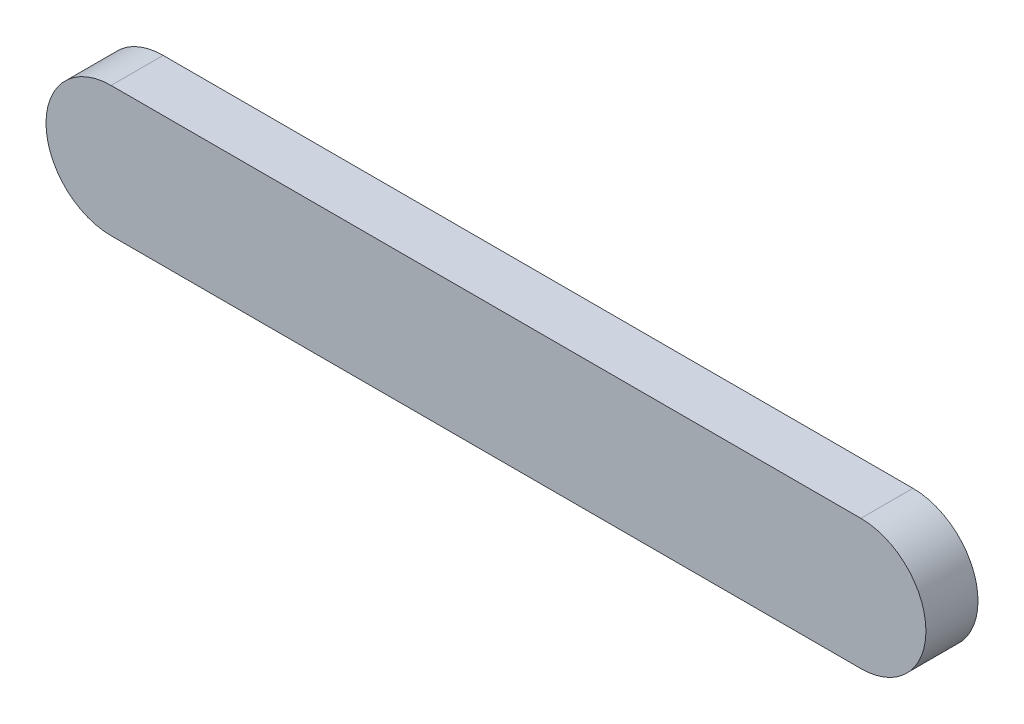
ISO-10303-21;
HEADER;
FILE_DESCRIPTION(('STEP AP214'),'2;1');
FILE_NAME('part.step','',(''),(''),'','','');
FILE_SCHEMA(('AUTOMOTIVE_DESIGN { 1 0 10303 214 1 1 1 1 }'));
ENDSEC;
DATA;
#1=APPLICATION_CONTEXT('core data for automotive mechanical design processes');
#2=APPLICATION_PROTOCOL_DEFINITION('international standard','automotive_design',2000,#1);
#3=PRODUCT_CONTEXT('',#1,'mechanical');
#4=PRODUCT('Part','Part','',(#3));
#5=PRODUCT_RELATED_PRODUCT_CATEGORY('part','',(#4));
#6=PRODUCT_DEFINITION_FORMATION('','',#4);
#7=PRODUCT_DEFINITION_CONTEXT('part definition',#1,'design');
#8=PRODUCT_DEFINITION('design','',#6,#7);
#9=PRODUCT_DEFINITION_SHAPE('','',#8);
#10=(LENGTH_UNIT() NAMED_UNIT(*) SI_UNIT(.MILLI.,.METRE.));
#11=(NAMED_UNIT(*) PLANE_ANGLE_UNIT() SI_UNIT($,.RADIAN.));
#12=(NAMED_UNIT(*) SI_UNIT($,.STERADIAN.) SOLID_ANGLE_UNIT());
#13=UNCERTAINTY_MEASURE_WITH_UNIT(LENGTH_MEASURE(1.E-05),#10,'distance_accuracy_value','');
#14=(GEOMETRIC_REPRESENTATION_CONTEXT(3) GLOBAL_UNCERTAINTY_ASSIGNED_CONTEXT((#13)) GLOBAL_UNIT_ASSIGNED_CONTEXT((#10,
#11,#12)) REPRESENTATION_CONTEXT('',''));
#15=CARTESIAN_POINT('',(0.,0.,0.));
#16=DIRECTION('',(0.,0.,1.));
#17=DIRECTION('',(1.,0.,0.));
#18=AXIS2_PLACEMENT_3D('',#15,#16,#17);
#19=CARTESIAN_POINT('',(0.,0.,20.));
#20=DIRECTION('',(0.,0.,-1.));
#21=DIRECTION('',(-1.,0.,0.));
#22=AXIS2_PLACEMENT_3D('',#19,#20,#21);
#23=CYLINDRICAL_SURFACE('',#22,25.);
#24=CARTESIAN_POINT('',(0.,0.,0.));
#25=DIRECTION('',(0.,0.,1.));
#26=DIRECTION('',(1.,0.,0.));
#27=AXIS2_PLACEMENT_3D('',#24,#25,#26);
#28=CIRCLE('',#27,25.);
#29=CARTESIAN_POINT('',(0.,25.,0.));
#30=VERTEX_POINT('',#29);
#31=CARTESIAN_POINT('',(0.,-25.,0.));
#32=VERTEX_POINT('',#31);
#33=EDGE_CURVE('E102',#30,#32,#28,.T.);
#34=ORIENTED_EDGE('',*,*,#33,.T.);
#35=DIRECTION('',(0.,0.,-1.));
#36=VECTOR('',#35,1.);
#37=CARTESIAN_POINT('',(0.,-25.,20.));
#38=LINE('',#37,#36);
#39=CARTESIAN_POINT('',(0.,-25.,20.));
#40=VERTEX_POINT('',#39);
#41=EDGE_CURVE('E11',#40,#32,#38,.T.);
#42=ORIENTED_EDGE('',*,*,#41,.F.);
#43=CARTESIAN_POINT('',(0.,0.,20.));
#44=DIRECTION('',(0.,0.,1.));
#45=DIRECTION('',(1.,0.,0.));
#46=AXIS2_PLACEMENT_3D('',#43,#44,#45);
#47=CIRCLE('',#46,25.);
#48=CARTESIAN_POINT('',(0.,25.,20.));
#49=VERTEX_POINT('',#48);
#50=EDGE_CURVE('E90',#49,#40,#47,.T.);
#51=ORIENTED_EDGE('',*,*,#50,.F.);
#52=DIRECTION('',(0.,0.,-1.));
#53=VECTOR('',#52,1.);
#54=CARTESIAN_POINT('',(0.,25.,20.));
#55=LINE('',#54,#53);
#56=EDGE_CURVE('E98',#49,#30,#55,.T.);
#57=ORIENTED_EDGE('',*,*,#56,.T.);
#58=EDGE_LOOP('',(#34,#42,#51,#57));
#59=FACE_BOUND('',#58,.T.);
#60=ADVANCED_FACE('F39',(#59),#23,.T.);
#61=CARTESIAN_POINT('',(0.,-25.,20.));
#62=DIRECTION('',(0.,1.,0.));
#63=DIRECTION('',(0.,0.,1.));
#64=AXIS2_PLACEMENT_3D('',#61,#62,#63);
#65=PLANE('',#64);
#66=DIRECTION('',(1.,0.,0.));
#67=VECTOR('',#66,1.);
#68=CARTESIAN_POINT('',(0.,-25.,0.));
#69=LINE('',#68,#67);
#70=CARTESIAN_POINT('',(288.,-25.,0.));
#71=VERTEX_POINT('',#70);
#72=EDGE_CURVE('E94',#32,#71,#69,.T.);
#73=ORIENTED_EDGE('',*,*,#72,.T.);
#74=DIRECTION('',(0.,0.,-1.));
#75=VECTOR('',#74,1.);
#76=CARTESIAN_POINT('',(288.,-25.,20.));
#77=LINE('',#76,#75);
#78=CARTESIAN_POINT('',(288.,-25.,20.));
#79=VERTEX_POINT('',#78);
#80=EDGE_CURVE('E47',#79,#71,#77,.T.);
#81=ORIENTED_EDGE('',*,*,#80,.F.);
#82=DIRECTION('',(1.,0.,0.));
#83=VECTOR('',#82,1.);
#84=CARTESIAN_POINT('',(0.,-25.,20.));
#85=LINE('',#84,#83);
#86=EDGE_CURVE('E85',#40,#79,#85,.T.);
#87=ORIENTED_EDGE('',*,*,#86,.F.);
#88=ORIENTED_EDGE('',*,*,#41,.T.);
#89=EDGE_LOOP('',(#73,#81,#87,#88));
#90=FACE_BOUND('',#89,.T.);
#91=ADVANCED_FACE('F93',(#90),#65,.F.);
#92=CARTESIAN_POINT('',(288.,0.,20.));
#93=DIRECTION('',(0.,0.,-1.));
#94=DIRECTION('',(-1.,0.,0.));
#95=AXIS2_PLACEMENT_3D('',#92,#93,#94);
#96=CYLINDRICAL_SURFACE('',#95,25.);
#97=CARTESIAN_POINT('',(288.,0.,0.));
#98=DIRECTION('',(0.,0.,1.));
#99=DIRECTION('',(1.,0.,0.));
#100=AXIS2_PLACEMENT_3D('',#97,#98,#99);
#101=CIRCLE('',#100,25.);
#102=CARTESIAN_POINT('',(288.,25.,0.));
#103=VERTEX_POINT('',#102);
#104=EDGE_CURVE('E72',#71,#103,#101,.T.);
#105=ORIENTED_EDGE('',*,*,#104,.T.);
#106=DIRECTION('',(0.,0.,-1.));
#107=VECTOR('',#106,1.);
#108=CARTESIAN_POINT('',(288.,25.,20.));
#109=LINE('',#108,#107);
#110=CARTESIAN_POINT('',(288.,25.,20.));
#111=VERTEX_POINT('',#110);
#112=EDGE_CURVE('E95',#111,#103,#109,.T.);
#113=ORIENTED_EDGE('',*,*,#112,.F.);
#114=CARTESIAN_POINT('',(288.,0.,20.));
#115=DIRECTION('',(0.,0.,1.));
#116=DIRECTION('',(1.,0.,0.));
#117=AXIS2_PLACEMENT_3D('',#114,#115,#116);
#118=CIRCLE('',#117,25.);
#119=EDGE_CURVE('E88',#79,#111,#118,.T.);
#120=ORIENTED_EDGE('',*,*,#119,.F.);
#121=ORIENTED_EDGE('',*,*,#80,.T.);
#122=EDGE_LOOP('',(#105,#113,#120,#121));
#123=FACE_BOUND('',#122,.T.);
#124=ADVANCED_FACE('F96',(#123),#96,.T.);
#125=CARTESIAN_POINT('',(0.,25.,20.));
#126=DIRECTION('',(0.,-1.,0.));
#127=DIRECTION('',(0.,0.,-1.));
#128=AXIS2_PLACEMENT_3D('',#125,#126,#127);
#129=PLANE('',#128);
#130=DIRECTION('',(-1.,0.,0.));
#131=VECTOR('',#130,1.);
#132=CARTESIAN_POINT('',(0.,25.,0.));
#133=LINE('',#132,#131);
#134=EDGE_CURVE('E78',#103,#30,#133,.T.);
#135=ORIENTED_EDGE('',*,*,#134,.T.);
#136=ORIENTED_EDGE('',*,*,#56,.F.);
#137=DIRECTION('',(-1.,0.,0.));
#138=VECTOR('',#137,1.);
#139=CARTESIAN_POINT('',(0.,25.,20.));
#140=LINE('',#139,#138);
#141=EDGE_CURVE('E55',#111,#49,#140,.T.);
#142=ORIENTED_EDGE('',*,*,#141,.F.);
#143=ORIENTED_EDGE('',*,*,#112,.T.);
#144=EDGE_LOOP('',(#135,#136,#142,#143));
#145=FACE_BOUND('',#144,.T.);
#146=ADVANCED_FACE('F109',(#145),#129,.F.);
#147=CARTESIAN_POINT('',(0.,0.,20.));
#148=DIRECTION('',(0.,0.,1.));
#149=DIRECTION('',(1.,0.,0.));
#150=AXIS2_PLACEMENT_3D('',#147,#148,#149);
#151=PLANE('',#150);
#152=ORIENTED_EDGE('',*,*,#50,.T.);
#153=ORIENTED_EDGE('',*,*,#86,.T.);
#154=ORIENTED_EDGE('',*,*,#119,.T.);
#155=ORIENTED_EDGE('',*,*,#141,.T.);
#156=EDGE_LOOP('',(#152,#153,#154,#155));
#157=FACE_BOUND('',#156,.T.);
#158=ADVANCED_FACE('F86',(#157),#151,.T.);
#159=CARTESIAN_POINT('',(0.,0.,0.));
#160=DIRECTION('',(0.,0.,1.));
#161=DIRECTION('',(1.,0.,0.));
#162=AXIS2_PLACEMENT_3D('',#159,#160,#161);
#163=PLANE('',#162);
#164=ORIENTED_EDGE('',*,*,#33,.F.);
#165=ORIENTED_EDGE('',*,*,#134,.F.);
#166=ORIENTED_EDGE('',*,*,#104,.F.);
#167=ORIENTED_EDGE('',*,*,#72,.F.);
#168=EDGE_LOOP('',(#164,#165,#166,#167));
#169=FACE_BOUND('',#168,.T.);
#170=ADVANCED_FACE('F112',(#169),#163,.F.);
#171=CLOSED_SHELL('',(#60,#91,#124,#146,#158,#170));
#172=MANIFOLD_SOLID_BREP('B2',#171);
#173=ADVANCED_BREP_SHAPE_REPRESENTATION('',(#18,#172),#14);
#174=SHAPE_DEFINITION_REPRESENTATION(#9,#173);
ENDSEC;
END-ISO-10303-21;
